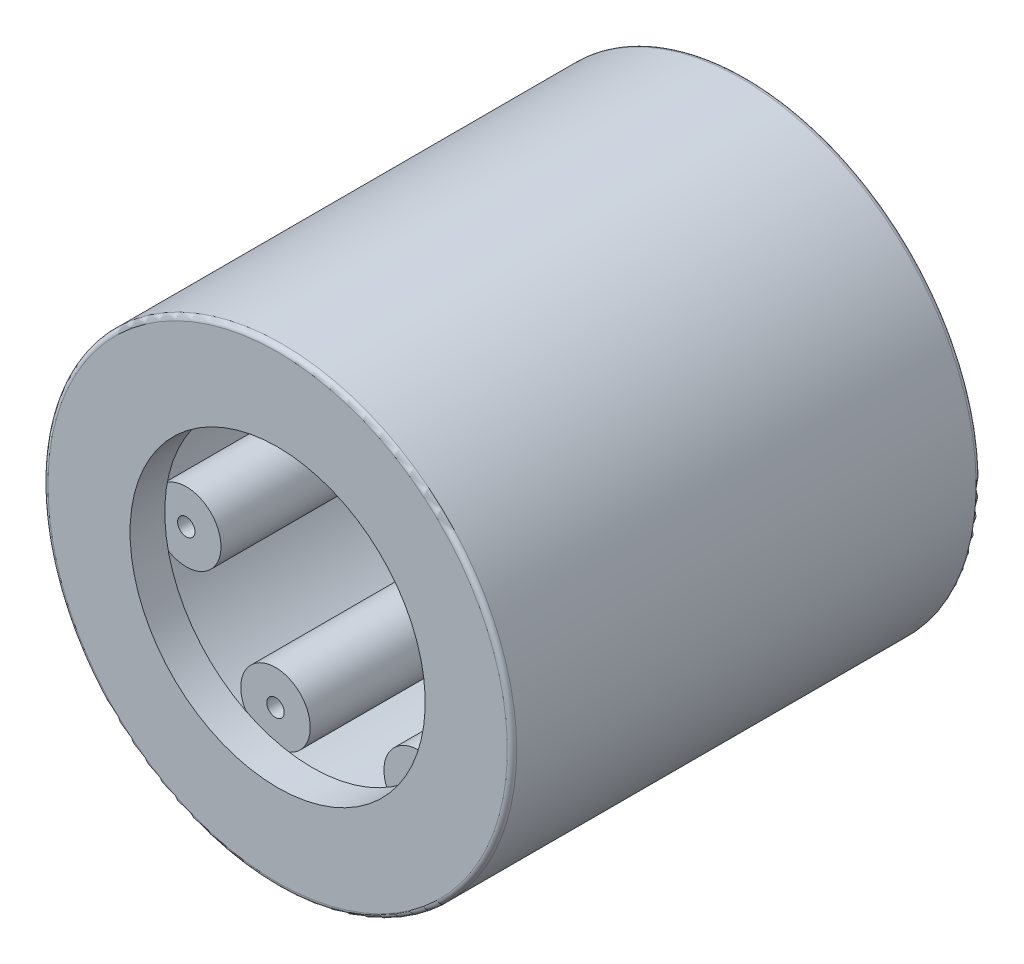
ISO-10303-21;
HEADER;
FILE_DESCRIPTION(('STEP AP214'),'2;1');
FILE_NAME('part.step','',(''),(''),'','','');
FILE_SCHEMA(('AUTOMOTIVE_DESIGN { 1 0 10303 214 1 1 1 1 }'));
ENDSEC;
DATA;
#1=APPLICATION_CONTEXT('core data for automotive mechanical design processes');
#2=APPLICATION_PROTOCOL_DEFINITION('international standard','automotive_design',2000,#1);
#3=PRODUCT_CONTEXT('',#1,'mechanical');
#4=PRODUCT('Part','Part','',(#3));
#5=PRODUCT_RELATED_PRODUCT_CATEGORY('part','',(#4));
#6=PRODUCT_DEFINITION_FORMATION('','',#4);
#7=PRODUCT_DEFINITION_CONTEXT('part definition',#1,'design');
#8=PRODUCT_DEFINITION('design','',#6,#7);
#9=PRODUCT_DEFINITION_SHAPE('','',#8);
#10=(LENGTH_UNIT() NAMED_UNIT(*) SI_UNIT(.MILLI.,.METRE.));
#11=(NAMED_UNIT(*) PLANE_ANGLE_UNIT() SI_UNIT($,.RADIAN.));
#12=(NAMED_UNIT(*) SI_UNIT($,.STERADIAN.) SOLID_ANGLE_UNIT());
#13=UNCERTAINTY_MEASURE_WITH_UNIT(LENGTH_MEASURE(1.E-05),#10,'distance_accuracy_value','');
#14=(GEOMETRIC_REPRESENTATION_CONTEXT(3) GLOBAL_UNCERTAINTY_ASSIGNED_CONTEXT((#13)) GLOBAL_UNIT_ASSIGNED_CONTEXT((#10,
#11,#12)) REPRESENTATION_CONTEXT('',''));
#15=CARTESIAN_POINT('',(0.,0.,0.));
#16=DIRECTION('',(0.,0.,1.));
#17=DIRECTION('',(1.,0.,0.));
#18=AXIS2_PLACEMENT_3D('',#15,#16,#17);
#19=CARTESIAN_POINT('',(0.,3.16666666666667,3.83333333333333));
#20=DIRECTION('',(0.,0.,-1.));
#21=DIRECTION('',(-1.,0.,0.));
#22=AXIS2_PLACEMENT_3D('',#19,#20,#21);
#23=PLANE('',#22);
#24=CARTESIAN_POINT('',(0.,3.16666666666667,3.83333333333333));
#25=DIRECTION('',(0.,0.,1.));
#26=DIRECTION('',(1.,0.,0.));
#27=AXIS2_PLACEMENT_3D('',#24,#25,#26);
#28=CIRCLE('',#27,0.166666666666666);
#29=CARTESIAN_POINT('',(0.166666666666666,3.16666666666667,3.83333333333333));
#30=VERTEX_POINT('',#29);
#31=EDGE_CURVE('E11',#30,#30,#28,.T.);
#32=ORIENTED_EDGE('',*,*,#31,.T.);
#33=EDGE_LOOP('',(#32));
#34=FACE_BOUND('',#33,.T.);
#35=ADVANCED_FACE('F51',(#34),#23,.F.);
#36=CARTESIAN_POINT('',(0.,3.16666666666667,3.83333333333333));
#37=DIRECTION('',(0.,0.,1.));
#38=DIRECTION('',(1.,0.,0.));
#39=AXIS2_PLACEMENT_3D('',#36,#37,#38);
#40=CYLINDRICAL_SURFACE('',#39,0.166666666666666);
#41=ORIENTED_EDGE('',*,*,#31,.F.);
#42=EDGE_LOOP('',(#41));
#43=FACE_BOUND('',#42,.T.);
#44=CARTESIAN_POINT('',(0.,3.16666666666667,-3.83333333333333));
#45=DIRECTION('',(0.,0.,1.));
#46=DIRECTION('',(1.,0.,0.));
#47=AXIS2_PLACEMENT_3D('',#44,#45,#46);
#48=CIRCLE('',#47,0.166666666666666);
#49=CARTESIAN_POINT('',(0.166666666666666,3.16666666666667,-3.83333333333333));
#50=VERTEX_POINT('',#49);
#51=EDGE_CURVE('E57',#50,#50,#48,.T.);
#52=ORIENTED_EDGE('',*,*,#51,.T.);
#53=EDGE_LOOP('',(#52));
#54=FACE_BOUND('',#53,.T.);
#55=ADVANCED_FACE('F63',(#43,#54),#40,.T.);
#56=CARTESIAN_POINT('',(0.,3.16666666666667,-3.83333333333333));
#57=DIRECTION('',(0.,0.,1.));
#58=DIRECTION('',(1.,0.,0.));
#59=AXIS2_PLACEMENT_3D('',#56,#57,#58);
#60=PLANE('',#59);
#61=ORIENTED_EDGE('',*,*,#51,.F.);
#62=EDGE_LOOP('',(#61));
#63=FACE_BOUND('',#62,.T.);
#64=ADVANCED_FACE('F65',(#63),#60,.F.);
#65=CLOSED_SHELL('',(#35,#55,#64));
#66=MANIFOLD_SOLID_BREP('B2',#65);
#67=CARTESIAN_POINT('',(0.,0.,4.5));
#68=DIRECTION('',(0.,0.,1.));
#69=DIRECTION('',(0.,-1.,0.));
#70=AXIS2_PLACEMENT_3D('',#67,#68,#69);
#71=CYLINDRICAL_SURFACE('',#70,3.73333333333333);
#72=CARTESIAN_POINT('',(0.,0.,-3.16666666666667));
#73=DIRECTION('',(0.,0.,1.));
#74=DIRECTION('',(1.,0.,0.));
#75=AXIS2_PLACEMENT_3D('',#72,#73,#74);
#76=CIRCLE('',#75,3.73333333333333);
#77=CARTESIAN_POINT('',(-3.53600489141785,-1.19768409259154,-3.16666666666667));
#78=VERTEX_POINT('',#77);
#79=CARTESIAN_POINT('',(-3.7054859762934,-0.455138942819345,-3.16666666666667));
#80=VERTEX_POINT('',#79);
#81=EDGE_CURVE('E206',#78,#80,#76,.F.);
#82=ORIENTED_EDGE('',*,*,#81,.F.);
#83=DIRECTION('',(0.,0.,1.));
#84=VECTOR('',#83,1.);
#85=CARTESIAN_POINT('',(-3.53600489141785,-1.19768409259154,0.));
#86=LINE('',#85,#84);
#87=CARTESIAN_POINT('',(-3.53600489141785,-1.19768409259154,3.16666666666667));
#88=VERTEX_POINT('',#87);
#89=EDGE_CURVE('E374',#88,#78,#86,.F.);
#90=ORIENTED_EDGE('',*,*,#89,.F.);
#91=CARTESIAN_POINT('',(0.,0.,3.16666666666667));
#92=DIRECTION('',(0.,0.,-1.));
#93=DIRECTION('',(-1.,0.,0.));
#94=AXIS2_PLACEMENT_3D('',#91,#92,#93);
#95=CIRCLE('',#94,3.73333333333333);
#96=CARTESIAN_POINT('',(-3.7054859762934,-0.455138942819348,3.16666666666667));
#97=VERTEX_POINT('',#96);
#98=EDGE_CURVE('E368',#97,#88,#95,.F.);
#99=ORIENTED_EDGE('',*,*,#98,.F.);
#100=DIRECTION('',(0.,0.,1.));
#101=VECTOR('',#100,1.);
#102=CARTESIAN_POINT('',(-3.7054859762934,-0.455138942819345,0.));
#103=LINE('',#102,#101);
#104=EDGE_CURVE('E371',#80,#97,#103,.T.);
#105=ORIENTED_EDGE('',*,*,#104,.F.);
#106=EDGE_LOOP('',(#82,#90,#99,#105));
#107=FACE_BOUND('',#106,.T.);
#108=CARTESIAN_POINT('',(0.,0.,-3.16666666666667));
#109=DIRECTION('',(0.,0.,1.));
#110=DIRECTION('',(0.,-1.,0.));
#111=AXIS2_PLACEMENT_3D('',#108,#109,#110);
#112=CIRCLE('',#111,3.73333333333333);
#113=CARTESIAN_POINT('',(1.95449076275606,-3.18084008338662,-3.16666666666667));
#114=VERTEX_POINT('',#113);
#115=CARTESIAN_POINT('',(1.26827585948236,-3.5113037638507,-3.16666666666667));
#116=VERTEX_POINT('',#115);
#117=EDGE_CURVE('E353',#114,#116,#112,.F.);
#118=ORIENTED_EDGE('',*,*,#117,.F.);
#119=DIRECTION('',(0.,0.,1.));
#120=VECTOR('',#119,1.);
#121=CARTESIAN_POINT('',(1.95449076275606,-3.18084008338662,0.));
#122=LINE('',#121,#120);
#123=CARTESIAN_POINT('',(1.95449076275606,-3.18084008338662,3.16666666666667));
#124=VERTEX_POINT('',#123);
#125=EDGE_CURVE('E350',#124,#114,#122,.F.);
#126=ORIENTED_EDGE('',*,*,#125,.F.);
#127=CARTESIAN_POINT('',(0.,0.,3.16666666666667));
#128=DIRECTION('',(0.,0.,-1.));
#129=DIRECTION('',(0.,1.,0.));
#130=AXIS2_PLACEMENT_3D('',#127,#128,#129);
#131=CIRCLE('',#130,3.73333333333333);
#132=CARTESIAN_POINT('',(1.26827585948235,-3.5113037638507,3.16666666666667));
#133=VERTEX_POINT('',#132);
#134=EDGE_CURVE('E344',#133,#124,#131,.F.);
#135=ORIENTED_EDGE('',*,*,#134,.F.);
#136=DIRECTION('',(0.,0.,1.));
#137=VECTOR('',#136,1.);
#138=CARTESIAN_POINT('',(1.26827585948235,-3.5113037638507,0.));
#139=LINE('',#138,#137);
#140=EDGE_CURVE('E347',#116,#133,#139,.T.);
#141=ORIENTED_EDGE('',*,*,#140,.F.);
#142=EDGE_LOOP('',(#118,#126,#135,#141));
#143=FACE_BOUND('',#142,.T.);
#144=CARTESIAN_POINT('',(0.,0.,-3.16666666666667));
#145=DIRECTION('',(0.,0.,1.));
#146=DIRECTION('',(1.,0.,0.));
#147=AXIS2_PLACEMENT_3D('',#144,#145,#146);
#148=CIRCLE('',#147,3.73333333333333);
#149=CARTESIAN_POINT('',(2.6661746715429,2.61329110483331,-3.16666666666667));
#150=VERTEX_POINT('',#149);
#151=CARTESIAN_POINT('',(3.14105011876087,2.01781612869213,-3.16666666666667));
#152=VERTEX_POINT('',#151);
#153=EDGE_CURVE('E329',#150,#152,#148,.F.);
#154=ORIENTED_EDGE('',*,*,#153,.F.);
#155=DIRECTION('',(0.,0.,1.));
#156=VECTOR('',#155,1.);
#157=CARTESIAN_POINT('',(2.6661746715429,2.6132911048333,0.));
#158=LINE('',#157,#156);
#159=CARTESIAN_POINT('',(2.6661746715429,2.6132911048333,3.16666666666667));
#160=VERTEX_POINT('',#159);
#161=EDGE_CURVE('E326',#160,#150,#158,.F.);
#162=ORIENTED_EDGE('',*,*,#161,.F.);
#163=CARTESIAN_POINT('',(0.,0.,3.16666666666667));
#164=DIRECTION('',(0.,0.,-1.));
#165=DIRECTION('',(-1.,0.,0.));
#166=AXIS2_PLACEMENT_3D('',#163,#164,#165);
#167=CIRCLE('',#166,3.73333333333333);
#168=CARTESIAN_POINT('',(3.14105011876087,2.01781612869213,3.16666666666667));
#169=VERTEX_POINT('',#168);
#170=EDGE_CURVE('E320',#169,#160,#167,.F.);
#171=ORIENTED_EDGE('',*,*,#170,.F.);
#172=DIRECTION('',(0.,0.,1.));
#173=VECTOR('',#172,1.);
#174=CARTESIAN_POINT('',(3.14105011876087,2.01781612869213,0.));
#175=LINE('',#174,#173);
#176=EDGE_CURVE('E323',#152,#169,#175,.T.);
#177=ORIENTED_EDGE('',*,*,#176,.F.);
#178=EDGE_LOOP('',(#154,#162,#171,#177));
#179=FACE_BOUND('',#178,.T.);
#180=CARTESIAN_POINT('',(0.,0.,3.83333333333333));
#181=DIRECTION('',(0.,0.,1.));
#182=DIRECTION('',(0.,-1.,0.));
#183=AXIS2_PLACEMENT_3D('',#180,#181,#182);
#184=CIRCLE('',#183,3.73333333333333);
#185=CARTESIAN_POINT('',(0.,-3.73333333333333,3.83333333333333));
#186=VERTEX_POINT('',#185);
#187=EDGE_CURVE('E299',#186,#186,#184,.T.);
#188=ORIENTED_EDGE('',*,*,#187,.T.);
#189=EDGE_LOOP('',(#188));
#190=FACE_BOUND('',#189,.T.);
#191=CARTESIAN_POINT('',(0.,0.,-3.83333333333333));
#192=DIRECTION('',(0.,0.,1.));
#193=DIRECTION('',(0.,-1.,0.));
#194=AXIS2_PLACEMENT_3D('',#191,#192,#193);
#195=CIRCLE('',#194,3.73333333333333);
#196=CARTESIAN_POINT('',(0.,-3.73333333333333,-3.83333333333333));
#197=VERTEX_POINT('',#196);
#198=EDGE_CURVE('E296',#197,#197,#195,.T.);
#199=ORIENTED_EDGE('',*,*,#198,.F.);
#200=EDGE_LOOP('',(#199));
#201=FACE_BOUND('',#200,.T.);
#202=CARTESIAN_POINT('',(0.,0.,-3.16666666666667));
#203=DIRECTION('',(0.,0.,1.));
#204=DIRECTION('',(0.,-1.,0.));
#205=AXIS2_PLACEMENT_3D('',#202,#203,#204);
#206=CIRCLE('',#205,3.73333333333333);
#207=CARTESIAN_POINT('',(-0.380820540931288,3.71385964912281,-3.16666666666667));
#208=VERTEX_POINT('',#207);
#209=CARTESIAN_POINT('',(0.380820540931288,3.71385964912281,-3.16666666666667));
#210=VERTEX_POINT('',#209);
#211=EDGE_CURVE('E317',#208,#210,#206,.F.);
#212=ORIENTED_EDGE('',*,*,#211,.F.);
#213=DIRECTION('',(0.,0.,1.));
#214=VECTOR('',#213,1.);
#215=CARTESIAN_POINT('',(-0.380820540931288,3.71385964912281,0.));
#216=LINE('',#215,#214);
#217=CARTESIAN_POINT('',(-0.380820540931288,3.71385964912281,3.16666666666667));
#218=VERTEX_POINT('',#217);
#219=EDGE_CURVE('E314',#218,#208,#216,.F.);
#220=ORIENTED_EDGE('',*,*,#219,.F.);
#221=CARTESIAN_POINT('',(0.,0.,3.16666666666667));
#222=DIRECTION('',(0.,0.,-1.));
#223=DIRECTION('',(0.,1.,0.));
#224=AXIS2_PLACEMENT_3D('',#221,#222,#223);
#225=CIRCLE('',#224,3.73333333333333);
#226=CARTESIAN_POINT('',(0.380820540931288,3.71385964912281,3.16666666666667));
#227=VERTEX_POINT('',#226);
#228=EDGE_CURVE('E308',#227,#218,#225,.F.);
#229=ORIENTED_EDGE('',*,*,#228,.F.);
#230=DIRECTION('',(0.,0.,1.));
#231=VECTOR('',#230,1.);
#232=CARTESIAN_POINT('',(0.380820540931288,3.71385964912281,0.));
#233=LINE('',#232,#231);
#234=EDGE_CURVE('E311',#210,#227,#233,.T.);
#235=ORIENTED_EDGE('',*,*,#234,.F.);
#236=EDGE_LOOP('',(#212,#220,#229,#235));
#237=FACE_BOUND('',#236,.T.);
#238=CARTESIAN_POINT('',(0.,0.,-3.16666666666667));
#239=DIRECTION('',(0.,0.,1.));
#240=DIRECTION('',(1.,0.,0.));
#241=AXIS2_PLACEMENT_3D('',#238,#239,#240);
#242=CIRCLE('',#241,3.73333333333333);
#243=CARTESIAN_POINT('',(3.70548597629339,-0.455138942819395,-3.16666666666667));
#244=VERTEX_POINT('',#243);
#245=CARTESIAN_POINT('',(3.53600489141783,-1.19768409259159,-3.16666666666667));
#246=VERTEX_POINT('',#245);
#247=EDGE_CURVE('E341',#244,#246,#242,.F.);
#248=ORIENTED_EDGE('',*,*,#247,.F.);
#249=DIRECTION('',(0.,0.,1.));
#250=VECTOR('',#249,1.);
#251=CARTESIAN_POINT('',(3.70548597629339,-0.455138942819395,0.));
#252=LINE('',#251,#250);
#253=CARTESIAN_POINT('',(3.70548597629339,-0.455138942819398,3.16666666666667));
#254=VERTEX_POINT('',#253);
#255=EDGE_CURVE('E338',#254,#244,#252,.F.);
#256=ORIENTED_EDGE('',*,*,#255,.F.);
#257=CARTESIAN_POINT('',(0.,0.,3.16666666666667));
#258=DIRECTION('',(0.,0.,-1.));
#259=DIRECTION('',(-1.,0.,0.));
#260=AXIS2_PLACEMENT_3D('',#257,#258,#259);
#261=CIRCLE('',#260,3.73333333333333);
#262=CARTESIAN_POINT('',(3.53600489141783,-1.19768409259158,3.16666666666667));
#263=VERTEX_POINT('',#262);
#264=EDGE_CURVE('E332',#263,#254,#261,.F.);
#265=ORIENTED_EDGE('',*,*,#264,.F.);
#266=DIRECTION('',(0.,0.,1.));
#267=VECTOR('',#266,1.);
#268=CARTESIAN_POINT('',(3.53600489141783,-1.19768409259159,0.));
#269=LINE('',#268,#267);
#270=EDGE_CURVE('E335',#246,#263,#269,.T.);
#271=ORIENTED_EDGE('',*,*,#270,.F.);
#272=EDGE_LOOP('',(#248,#256,#265,#271));
#273=FACE_BOUND('',#272,.T.);
#274=CARTESIAN_POINT('',(0.,0.,-3.16666666666667));
#275=DIRECTION('',(0.,0.,1.));
#276=DIRECTION('',(0.,-1.,0.));
#277=AXIS2_PLACEMENT_3D('',#274,#275,#276);
#278=CIRCLE('',#277,3.73333333333333);
#279=CARTESIAN_POINT('',(-1.2682758594824,-3.51130376385068,-3.16666666666667));
#280=VERTEX_POINT('',#279);
#281=CARTESIAN_POINT('',(-1.9544907627561,-3.1808400833866,-3.16666666666667));
#282=VERTEX_POINT('',#281);
#283=EDGE_CURVE('E365',#280,#282,#278,.F.);
#284=ORIENTED_EDGE('',*,*,#283,.F.);
#285=DIRECTION('',(0.,0.,1.));
#286=VECTOR('',#285,1.);
#287=CARTESIAN_POINT('',(-1.2682758594824,-3.51130376385068,0.));
#288=LINE('',#287,#286);
#289=CARTESIAN_POINT('',(-1.2682758594824,-3.51130376385068,3.16666666666667));
#290=VERTEX_POINT('',#289);
#291=EDGE_CURVE('E362',#290,#280,#288,.F.);
#292=ORIENTED_EDGE('',*,*,#291,.F.);
#293=CARTESIAN_POINT('',(0.,0.,3.16666666666667));
#294=DIRECTION('',(0.,0.,-1.));
#295=DIRECTION('',(0.,1.,0.));
#296=AXIS2_PLACEMENT_3D('',#293,#294,#295);
#297=CIRCLE('',#296,3.73333333333333);
#298=CARTESIAN_POINT('',(-1.9544907627561,-3.1808400833866,3.16666666666667));
#299=VERTEX_POINT('',#298);
#300=EDGE_CURVE('E356',#299,#290,#297,.F.);
#301=ORIENTED_EDGE('',*,*,#300,.F.);
#302=DIRECTION('',(0.,0.,1.));
#303=VECTOR('',#302,1.);
#304=CARTESIAN_POINT('',(-1.9544907627561,-3.1808400833866,0.));
#305=LINE('',#304,#303);
#306=EDGE_CURVE('E359',#282,#299,#305,.T.);
#307=ORIENTED_EDGE('',*,*,#306,.F.);
#308=EDGE_LOOP('',(#284,#292,#301,#307));
#309=FACE_BOUND('',#308,.T.);
#310=CARTESIAN_POINT('',(0.,0.,-3.16666666666667));
#311=DIRECTION('',(0.,0.,1.));
#312=DIRECTION('',(1.,0.,0.));
#313=AXIS2_PLACEMENT_3D('',#310,#311,#312);
#314=CIRCLE('',#313,3.73333333333333);
#315=CARTESIAN_POINT('',(-3.14105011876084,2.01781612869217,-3.16666666666667));
#316=VERTEX_POINT('',#315);
#317=CARTESIAN_POINT('',(-2.66617467154286,2.61329110483334,-3.16666666666667));
#318=VERTEX_POINT('',#317);
#319=EDGE_CURVE('E113',#316,#318,#314,.F.);
#320=ORIENTED_EDGE('',*,*,#319,.F.);
#321=DIRECTION('',(0.,0.,1.));
#322=VECTOR('',#321,1.);
#323=CARTESIAN_POINT('',(-3.14105011876084,2.01781612869217,0.));
#324=LINE('',#323,#322);
#325=CARTESIAN_POINT('',(-3.14105011876084,2.01781612869218,3.16666666666667));
#326=VERTEX_POINT('',#325);
#327=EDGE_CURVE('E194',#326,#316,#324,.F.);
#328=ORIENTED_EDGE('',*,*,#327,.F.);
#329=CARTESIAN_POINT('',(0.,0.,3.16666666666667));
#330=DIRECTION('',(0.,0.,-1.));
#331=DIRECTION('',(-1.,0.,0.));
#332=AXIS2_PLACEMENT_3D('',#329,#330,#331);
#333=CIRCLE('',#332,3.73333333333333);
#334=CARTESIAN_POINT('',(-2.66617467154286,2.61329110483334,3.16666666666667));
#335=VERTEX_POINT('',#334);
#336=EDGE_CURVE('E196',#335,#326,#333,.F.);
#337=ORIENTED_EDGE('',*,*,#336,.F.);
#338=DIRECTION('',(0.,0.,1.));
#339=VECTOR('',#338,1.);
#340=CARTESIAN_POINT('',(-2.66617467154286,2.61329110483334,0.));
#341=LINE('',#340,#339);
#342=EDGE_CURVE('E118',#318,#335,#341,.T.);
#343=ORIENTED_EDGE('',*,*,#342,.F.);
#344=EDGE_LOOP('',(#320,#328,#337,#343));
#345=FACE_BOUND('',#344,.T.);
#346=ADVANCED_FACE('F98',(#107,#143,#179,#190,#201,#237,#273,#309,#345),#71,.F.);
#347=CARTESIAN_POINT('',(0.,0.,4.5));
#348=DIRECTION('',(0.,0.,1.));
#349=DIRECTION('',(0.,-1.,0.));
#350=AXIS2_PLACEMENT_3D('',#347,#348,#349);
#351=CYLINDRICAL_SURFACE('',#350,4.5);
#352=CARTESIAN_POINT('',(0.,0.,-4.41));
#353=DIRECTION('',(0.,0.,1.));
#354=DIRECTION('',(0.,-1.,0.));
#355=AXIS2_PLACEMENT_3D('',#352,#353,#354);
#356=CIRCLE('',#355,4.5);
#357=CARTESIAN_POINT('',(0.,-4.5,-4.41));
#358=VERTEX_POINT('',#357);
#359=EDGE_CURVE('E384',#358,#358,#356,.T.);
#360=ORIENTED_EDGE('',*,*,#359,.T.);
#361=EDGE_LOOP('',(#360));
#362=FACE_BOUND('',#361,.T.);
#363=CARTESIAN_POINT('',(0.,0.,4.41));
#364=DIRECTION('',(0.,0.,-1.));
#365=DIRECTION('',(0.,1.,0.));
#366=AXIS2_PLACEMENT_3D('',#363,#364,#365);
#367=CIRCLE('',#366,4.5);
#368=CARTESIAN_POINT('',(0.,4.5,4.41));
#369=VERTEX_POINT('',#368);
#370=EDGE_CURVE('E381',#369,#369,#367,.T.);
#371=ORIENTED_EDGE('',*,*,#370,.T.);
#372=EDGE_LOOP('',(#371));
#373=FACE_BOUND('',#372,.T.);
#374=ADVANCED_FACE('F398',(#362,#373),#351,.T.);
#375=CARTESIAN_POINT('',(0.,4.5,4.5));
#376=DIRECTION('',(0.,0.,-1.));
#377=DIRECTION('',(0.,1.,0.));
#378=AXIS2_PLACEMENT_3D('',#375,#376,#377);
#379=PLANE('',#378);
#380=CARTESIAN_POINT('',(0.,0.,4.5));
#381=DIRECTION('',(0.,0.,-1.));
#382=DIRECTION('',(0.,1.,0.));
#383=AXIS2_PLACEMENT_3D('',#380,#381,#382);
#384=CIRCLE('',#383,4.41);
#385=CARTESIAN_POINT('',(0.,4.41,4.5));
#386=VERTEX_POINT('',#385);
#387=EDGE_CURVE('E49',#386,#386,#384,.F.);
#388=ORIENTED_EDGE('',*,*,#387,.T.);
#389=EDGE_LOOP('',(#388));
#390=FACE_BOUND('',#389,.T.);
#391=CARTESIAN_POINT('',(0.,0.,4.5));
#392=DIRECTION('',(0.,0.,1.));
#393=DIRECTION('',(0.,-1.,0.));
#394=AXIS2_PLACEMENT_3D('',#391,#392,#393);
#395=CIRCLE('',#394,2.83333333333333);
#396=CARTESIAN_POINT('',(0.,-2.83333333333333,4.5));
#397=VERTEX_POINT('',#396);
#398=EDGE_CURVE('E305',#397,#397,#395,.T.);
#399=ORIENTED_EDGE('',*,*,#398,.F.);
#400=EDGE_LOOP('',(#399));
#401=FACE_BOUND('',#400,.T.);
#402=ADVANCED_FACE('F401',(#390,#401),#379,.F.);
#403=CARTESIAN_POINT('',(0.,0.,4.5));
#404=DIRECTION('',(0.,0.,1.));
#405=DIRECTION('',(0.,-1.,0.));
#406=AXIS2_PLACEMENT_3D('',#403,#404,#405);
#407=CYLINDRICAL_SURFACE('',#406,2.83333333333333);
#408=CARTESIAN_POINT('',(0.,0.,3.83333333333333));
#409=DIRECTION('',(0.,0.,1.));
#410=DIRECTION('',(0.,-1.,0.));
#411=AXIS2_PLACEMENT_3D('',#408,#409,#410);
#412=CIRCLE('',#411,2.83333333333333);
#413=CARTESIAN_POINT('',(0.,-2.83333333333333,3.83333333333333));
#414=VERTEX_POINT('',#413);
#415=EDGE_CURVE('E302',#414,#414,#412,.T.);
#416=ORIENTED_EDGE('',*,*,#415,.F.);
#417=EDGE_LOOP('',(#416));
#418=FACE_BOUND('',#417,.T.);
#419=ORIENTED_EDGE('',*,*,#398,.T.);
#420=EDGE_LOOP('',(#419));
#421=FACE_BOUND('',#420,.T.);
#422=ADVANCED_FACE('F411',(#418,#421),#407,.F.);
#423=CARTESIAN_POINT('',(0.,2.83333333333333,3.83333333333333));
#424=DIRECTION('',(0.,0.,1.));
#425=DIRECTION('',(0.,-1.,0.));
#426=AXIS2_PLACEMENT_3D('',#423,#424,#425);
#427=PLANE('',#426);
#428=ORIENTED_EDGE('',*,*,#187,.F.);
#429=EDGE_LOOP('',(#428));
#430=FACE_BOUND('',#429,.T.);
#431=ORIENTED_EDGE('',*,*,#415,.T.);
#432=EDGE_LOOP('',(#431));
#433=FACE_BOUND('',#432,.T.);
#434=ADVANCED_FACE('F416',(#430,#433),#427,.F.);
#435=CARTESIAN_POINT('',(0.,3.73333333333333,-3.83333333333333));
#436=DIRECTION('',(0.,0.,-1.));
#437=DIRECTION('',(0.,1.,0.));
#438=AXIS2_PLACEMENT_3D('',#435,#436,#437);
#439=PLANE('',#438);
#440=CARTESIAN_POINT('',(0.,0.,-3.83333333333333));
#441=DIRECTION('',(0.,0.,1.));
#442=DIRECTION('',(0.,-1.,0.));
#443=AXIS2_PLACEMENT_3D('',#440,#441,#442);
#444=CIRCLE('',#443,2.83333333333333);
#445=CARTESIAN_POINT('',(0.,-2.83333333333333,-3.83333333333333));
#446=VERTEX_POINT('',#445);
#447=EDGE_CURVE('E293',#446,#446,#444,.T.);
#448=ORIENTED_EDGE('',*,*,#447,.F.);
#449=EDGE_LOOP('',(#448));
#450=FACE_BOUND('',#449,.T.);
#451=ORIENTED_EDGE('',*,*,#198,.T.);
#452=EDGE_LOOP('',(#451));
#453=FACE_BOUND('',#452,.T.);
#454=ADVANCED_FACE('F423',(#450,#453),#439,.F.);
#455=CARTESIAN_POINT('',(0.,0.,4.5));
#456=DIRECTION('',(0.,0.,1.));
#457=DIRECTION('',(0.,-1.,0.));
#458=AXIS2_PLACEMENT_3D('',#455,#456,#457);
#459=CYLINDRICAL_SURFACE('',#458,2.83333333333333);
#460=CARTESIAN_POINT('',(0.,0.,-4.5));
#461=DIRECTION('',(0.,0.,1.));
#462=DIRECTION('',(0.,-1.,0.));
#463=AXIS2_PLACEMENT_3D('',#460,#461,#462);
#464=CIRCLE('',#463,2.83333333333333);
#465=CARTESIAN_POINT('',(0.,-2.83333333333333,-4.5));
#466=VERTEX_POINT('',#465);
#467=EDGE_CURVE('E290',#466,#466,#464,.T.);
#468=ORIENTED_EDGE('',*,*,#467,.F.);
#469=EDGE_LOOP('',(#468));
#470=FACE_BOUND('',#469,.T.);
#471=ORIENTED_EDGE('',*,*,#447,.T.);
#472=EDGE_LOOP('',(#471));
#473=FACE_BOUND('',#472,.T.);
#474=ADVANCED_FACE('F438',(#470,#473),#459,.F.);
#475=CARTESIAN_POINT('',(0.,2.83333333333333,-4.5));
#476=DIRECTION('',(0.,0.,1.));
#477=DIRECTION('',(0.,-1.,0.));
#478=AXIS2_PLACEMENT_3D('',#475,#476,#477);
#479=PLANE('',#478);
#480=CARTESIAN_POINT('',(0.,0.,-4.5));
#481=DIRECTION('',(0.,0.,1.));
#482=DIRECTION('',(0.,-1.,0.));
#483=AXIS2_PLACEMENT_3D('',#480,#481,#482);
#484=CIRCLE('',#483,4.41);
#485=CARTESIAN_POINT('',(0.,-4.41,-4.5));
#486=VERTEX_POINT('',#485);
#487=EDGE_CURVE('E106',#486,#486,#484,.F.);
#488=ORIENTED_EDGE('',*,*,#487,.T.);
#489=EDGE_LOOP('',(#488));
#490=FACE_BOUND('',#489,.T.);
#491=ORIENTED_EDGE('',*,*,#467,.T.);
#492=EDGE_LOOP('',(#491));
#493=FACE_BOUND('',#492,.T.);
#494=ADVANCED_FACE('F389',(#490,#493),#479,.F.);
#495=CARTESIAN_POINT('',(0.,3.83333333333333,-3.16666666666667));
#496=DIRECTION('',(0.,0.,1.));
#497=DIRECTION('',(0.,-1.,0.));
#498=AXIS2_PLACEMENT_3D('',#495,#496,#497);
#499=PLANE('',#498);
#500=CARTESIAN_POINT('',(0.,3.16666666666667,-3.16666666666667));
#501=DIRECTION('',(0.,0.,1.));
#502=DIRECTION('',(0.,-1.,0.));
#503=AXIS2_PLACEMENT_3D('',#500,#501,#502);
#504=CIRCLE('',#503,0.166666666666666);
#505=CARTESIAN_POINT('',(0.,3.,-3.16666666666667));
#506=VERTEX_POINT('',#505);
#507=EDGE_CURVE('E278',#506,#506,#504,.T.);
#508=ORIENTED_EDGE('',*,*,#507,.T.);
#509=EDGE_LOOP('',(#508));
#510=FACE_BOUND('',#509,.T.);
#511=CARTESIAN_POINT('',(0.,3.16666666666667,-3.16666666666667));
#512=DIRECTION('',(0.,0.,1.));
#513=DIRECTION('',(0.,-1.,0.));
#514=AXIS2_PLACEMENT_3D('',#511,#512,#513);
#515=CIRCLE('',#514,0.666666666666667);
#516=EDGE_CURVE('E287',#208,#210,#515,.T.);
#517=ORIENTED_EDGE('',*,*,#516,.F.);
#518=ORIENTED_EDGE('',*,*,#211,.T.);
#519=EDGE_LOOP('',(#517,#518));
#520=FACE_BOUND('',#519,.T.);
#521=ADVANCED_FACE('F445',(#510,#520),#499,.F.);
#522=CARTESIAN_POINT('',(0.,3.16666666666667,3.16666666666667));
#523=DIRECTION('',(0.,0.,1.));
#524=DIRECTION('',(0.,-1.,0.));
#525=AXIS2_PLACEMENT_3D('',#522,#523,#524);
#526=CYLINDRICAL_SURFACE('',#525,0.666666666666667);
#527=CARTESIAN_POINT('',(0.,3.16666666666667,3.16666666666667));
#528=DIRECTION('',(0.,0.,1.));
#529=DIRECTION('',(0.,-1.,0.));
#530=AXIS2_PLACEMENT_3D('',#527,#528,#529);
#531=CIRCLE('',#530,0.666666666666667);
#532=EDGE_CURVE('E284',#218,#227,#531,.T.);
#533=ORIENTED_EDGE('',*,*,#532,.F.);
#534=ORIENTED_EDGE('',*,*,#219,.T.);
#535=ORIENTED_EDGE('',*,*,#516,.T.);
#536=ORIENTED_EDGE('',*,*,#234,.T.);
#537=EDGE_LOOP('',(#533,#534,#535,#536));
#538=FACE_BOUND('',#537,.T.);
#539=ADVANCED_FACE('F448',(#538),#526,.T.);
#540=CARTESIAN_POINT('',(0.,3.83333333333333,3.16666666666667));
#541=DIRECTION('',(0.,0.,-1.));
#542=DIRECTION('',(0.,1.,0.));
#543=AXIS2_PLACEMENT_3D('',#540,#541,#542);
#544=PLANE('',#543);
#545=CARTESIAN_POINT('',(0.,3.16666666666667,3.16666666666667));
#546=DIRECTION('',(0.,0.,1.));
#547=DIRECTION('',(0.,-1.,0.));
#548=AXIS2_PLACEMENT_3D('',#545,#546,#547);
#549=CIRCLE('',#548,0.166666666666666);
#550=CARTESIAN_POINT('',(0.,3.,3.16666666666667));
#551=VERTEX_POINT('',#550);
#552=EDGE_CURVE('E281',#551,#551,#549,.T.);
#553=ORIENTED_EDGE('',*,*,#552,.F.);
#554=EDGE_LOOP('',(#553));
#555=FACE_BOUND('',#554,.T.);
#556=ORIENTED_EDGE('',*,*,#532,.T.);
#557=ORIENTED_EDGE('',*,*,#228,.T.);
#558=EDGE_LOOP('',(#556,#557));
#559=FACE_BOUND('',#558,.T.);
#560=ADVANCED_FACE('F452',(#555,#559),#544,.F.);
#561=CARTESIAN_POINT('',(0.,3.16666666666667,3.16666666666667));
#562=DIRECTION('',(0.,0.,1.));
#563=DIRECTION('',(0.,-1.,0.));
#564=AXIS2_PLACEMENT_3D('',#561,#562,#563);
#565=CYLINDRICAL_SURFACE('',#564,0.166666666666666);
#566=ORIENTED_EDGE('',*,*,#507,.F.);
#567=EDGE_LOOP('',(#566));
#568=FACE_BOUND('',#567,.T.);
#569=ORIENTED_EDGE('',*,*,#552,.T.);
#570=EDGE_LOOP('',(#569));
#571=FACE_BOUND('',#570,.T.);
#572=ADVANCED_FACE('F456',(#568,#571),#565,.F.);
#573=CARTESIAN_POINT('',(2.99702068279412,2.39004424045847,-3.16666666666667));
#574=DIRECTION('',(0.,0.,1.));
#575=DIRECTION('',(-0.781831482468031,-0.623489801858732,0.));
#576=AXIS2_PLACEMENT_3D('',#573,#574,#575);
#577=PLANE('',#576);
#578=CARTESIAN_POINT('',(2.4757996944821,1.97438437255265,-3.16666666666667));
#579=DIRECTION('',(0.,0.,1.));
#580=DIRECTION('',(-0.781831482468031,-0.623489801858732,0.));
#581=AXIS2_PLACEMENT_3D('',#578,#579,#580);
#582=CIRCLE('',#581,0.166666666666666);
#583=CARTESIAN_POINT('',(2.34549444740409,1.8704694055762,-3.16666666666667));
#584=VERTEX_POINT('',#583);
#585=EDGE_CURVE('E266',#584,#584,#582,.T.);
#586=ORIENTED_EDGE('',*,*,#585,.T.);
#587=EDGE_LOOP('',(#586));
#588=FACE_BOUND('',#587,.T.);
#589=CARTESIAN_POINT('',(2.4757996944821,1.97438437255265,-3.16666666666667));
#590=DIRECTION('',(0.,0.,1.));
#591=DIRECTION('',(-0.781831482468031,-0.623489801858732,0.));
#592=AXIS2_PLACEMENT_3D('',#589,#590,#591);
#593=CIRCLE('',#592,0.666666666666667);
#594=EDGE_CURVE('E275',#150,#152,#593,.T.);
#595=ORIENTED_EDGE('',*,*,#594,.F.);
#596=ORIENTED_EDGE('',*,*,#153,.T.);
#597=EDGE_LOOP('',(#595,#596));
#598=FACE_BOUND('',#597,.T.);
#599=ADVANCED_FACE('F460',(#588,#598),#577,.F.);
#600=CARTESIAN_POINT('',(2.4757996944821,1.97438437255265,3.16666666666667));
#601=DIRECTION('',(0.,0.,1.));
#602=DIRECTION('',(-0.781831482468031,-0.623489801858732,0.));
#603=AXIS2_PLACEMENT_3D('',#600,#601,#602);
#604=CYLINDRICAL_SURFACE('',#603,0.666666666666667);
#605=CARTESIAN_POINT('',(2.4757996944821,1.97438437255265,3.16666666666667));
#606=DIRECTION('',(0.,0.,1.));
#607=DIRECTION('',(-0.781831482468031,-0.623489801858732,0.));
#608=AXIS2_PLACEMENT_3D('',#605,#606,#607);
#609=CIRCLE('',#608,0.666666666666667);
#610=EDGE_CURVE('E272',#160,#169,#609,.T.);
#611=ORIENTED_EDGE('',*,*,#610,.F.);
#612=ORIENTED_EDGE('',*,*,#161,.T.);
#613=ORIENTED_EDGE('',*,*,#594,.T.);
#614=ORIENTED_EDGE('',*,*,#176,.T.);
#615=EDGE_LOOP('',(#611,#612,#613,#614));
#616=FACE_BOUND('',#615,.T.);
#617=ADVANCED_FACE('F464',(#616),#604,.T.);
#618=CARTESIAN_POINT('',(2.99702068279412,2.39004424045847,3.16666666666667));
#619=DIRECTION('',(0.,0.,-1.));
#620=DIRECTION('',(0.781831482468031,0.623489801858732,0.));
#621=AXIS2_PLACEMENT_3D('',#618,#619,#620);
#622=PLANE('',#621);
#623=CARTESIAN_POINT('',(2.4757996944821,1.97438437255265,3.16666666666667));
#624=DIRECTION('',(0.,0.,1.));
#625=DIRECTION('',(-0.781831482468031,-0.623489801858732,0.));
#626=AXIS2_PLACEMENT_3D('',#623,#624,#625);
#627=CIRCLE('',#626,0.166666666666666);
#628=CARTESIAN_POINT('',(2.34549444740409,1.8704694055762,3.16666666666667));
#629=VERTEX_POINT('',#628);
#630=EDGE_CURVE('E269',#629,#629,#627,.T.);
#631=ORIENTED_EDGE('',*,*,#630,.F.);
#632=EDGE_LOOP('',(#631));
#633=FACE_BOUND('',#632,.T.);
#634=ORIENTED_EDGE('',*,*,#610,.T.);
#635=ORIENTED_EDGE('',*,*,#170,.T.);
#636=EDGE_LOOP('',(#634,#635));
#637=FACE_BOUND('',#636,.T.);
#638=ADVANCED_FACE('F468',(#633,#637),#622,.F.);
#639=CARTESIAN_POINT('',(2.4757996944821,1.97438437255265,3.16666666666667));
#640=DIRECTION('',(0.,0.,1.));
#641=DIRECTION('',(-0.781831482468031,-0.623489801858732,0.));
#642=AXIS2_PLACEMENT_3D('',#639,#640,#641);
#643=CYLINDRICAL_SURFACE('',#642,0.166666666666666);
#644=ORIENTED_EDGE('',*,*,#585,.F.);
#645=EDGE_LOOP('',(#644));
#646=FACE_BOUND('',#645,.T.);
#647=ORIENTED_EDGE('',*,*,#630,.T.);
#648=EDGE_LOOP('',(#647));
#649=FACE_BOUND('',#648,.T.);
#650=ADVANCED_FACE('F472',(#646,#649),#643,.F.);
#651=CARTESIAN_POINT('',(3.73722366336365,-0.85299691349922,-3.16666666666667));
#652=DIRECTION('',(0.,0.,1.));
#653=DIRECTION('',(-0.974927912181823,0.222520933956318,0.));
#654=AXIS2_PLACEMENT_3D('',#651,#652,#653);
#655=PLANE('',#654);
#656=CARTESIAN_POINT('',(3.08727172190911,-0.704649624195008,-3.16666666666667));
#657=DIRECTION('',(0.,0.,1.));
#658=DIRECTION('',(-0.974927912181823,0.222520933956318,0.));
#659=AXIS2_PLACEMENT_3D('',#656,#657,#658);
#660=CIRCLE('',#659,0.166666666666666);
#661=CARTESIAN_POINT('',(2.92478373654547,-0.667562801868955,-3.16666666666667));
#662=VERTEX_POINT('',#661);
#663=EDGE_CURVE('E254',#662,#662,#660,.T.);
#664=ORIENTED_EDGE('',*,*,#663,.T.);
#665=EDGE_LOOP('',(#664));
#666=FACE_BOUND('',#665,.T.);
#667=CARTESIAN_POINT('',(3.08727172190911,-0.704649624195008,-3.16666666666667));
#668=DIRECTION('',(0.,0.,1.));
#669=DIRECTION('',(-0.974927912181823,0.222520933956318,0.));
#670=AXIS2_PLACEMENT_3D('',#667,#668,#669);
#671=CIRCLE('',#670,0.666666666666667);
#672=EDGE_CURVE('E263',#244,#246,#671,.T.);
#673=ORIENTED_EDGE('',*,*,#672,.F.);
#674=ORIENTED_EDGE('',*,*,#247,.T.);
#675=EDGE_LOOP('',(#673,#674));
#676=FACE_BOUND('',#675,.T.);
#677=ADVANCED_FACE('F476',(#666,#676),#655,.F.);
#678=CARTESIAN_POINT('',(3.0872717219091,-0.704649624195008,3.16666666666667));
#679=DIRECTION('',(0.,0.,1.));
#680=DIRECTION('',(-0.974927912181823,0.222520933956318,0.));
#681=AXIS2_PLACEMENT_3D('',#678,#679,#680);
#682=CYLINDRICAL_SURFACE('',#681,0.666666666666667);
#683=CARTESIAN_POINT('',(3.0872717219091,-0.704649624195008,3.16666666666667));
#684=DIRECTION('',(0.,0.,1.));
#685=DIRECTION('',(-0.974927912181823,0.222520933956318,0.));
#686=AXIS2_PLACEMENT_3D('',#683,#684,#685);
#687=CIRCLE('',#686,0.666666666666667);
#688=EDGE_CURVE('E260',#254,#263,#687,.T.);
#689=ORIENTED_EDGE('',*,*,#688,.F.);
#690=ORIENTED_EDGE('',*,*,#255,.T.);
#691=ORIENTED_EDGE('',*,*,#672,.T.);
#692=ORIENTED_EDGE('',*,*,#270,.T.);
#693=EDGE_LOOP('',(#689,#690,#691,#692));
#694=FACE_BOUND('',#693,.T.);
#695=ADVANCED_FACE('F480',(#694),#682,.T.);
#696=CARTESIAN_POINT('',(3.73722366336365,-0.85299691349922,3.16666666666667));
#697=DIRECTION('',(0.,0.,-1.));
#698=DIRECTION('',(0.974927912181823,-0.222520933956318,0.));
#699=AXIS2_PLACEMENT_3D('',#696,#697,#698);
#700=PLANE('',#699);
#701=CARTESIAN_POINT('',(3.0872717219091,-0.704649624195008,3.16666666666667));
#702=DIRECTION('',(0.,0.,1.));
#703=DIRECTION('',(-0.974927912181823,0.222520933956318,0.));
#704=AXIS2_PLACEMENT_3D('',#701,#702,#703);
#705=CIRCLE('',#704,0.166666666666666);
#706=CARTESIAN_POINT('',(2.92478373654547,-0.667562801868955,3.16666666666667));
#707=VERTEX_POINT('',#706);
#708=EDGE_CURVE('E257',#707,#707,#705,.T.);
#709=ORIENTED_EDGE('',*,*,#708,.F.);
#710=EDGE_LOOP('',(#709));
#711=FACE_BOUND('',#710,.T.);
#712=ORIENTED_EDGE('',*,*,#688,.T.);
#713=ORIENTED_EDGE('',*,*,#264,.T.);
#714=EDGE_LOOP('',(#712,#713));
#715=FACE_BOUND('',#714,.T.);
#716=ADVANCED_FACE('F484',(#711,#715),#700,.F.);
#717=CARTESIAN_POINT('',(3.0872717219091,-0.704649624195008,3.16666666666667));
#718=DIRECTION('',(0.,0.,1.));
#719=DIRECTION('',(-0.974927912181823,0.222520933956318,0.));
#720=AXIS2_PLACEMENT_3D('',#717,#718,#719);
#721=CYLINDRICAL_SURFACE('',#720,0.166666666666666);
#722=ORIENTED_EDGE('',*,*,#663,.F.);
#723=EDGE_LOOP('',(#722));
#724=FACE_BOUND('',#723,.T.);
#725=ORIENTED_EDGE('',*,*,#708,.T.);
#726=EDGE_LOOP('',(#725));
#727=FACE_BOUND('',#726,.T.);
#728=ADVANCED_FACE('F488',(#724,#727),#721,.F.);
#729=CARTESIAN_POINT('',(1.66322099995062,-3.45371399362595,-3.16666666666667));
#730=DIRECTION('',(0.,0.,1.));
#731=DIRECTION('',(-0.433883739117553,0.900968867902422,0.));
#732=AXIS2_PLACEMENT_3D('',#729,#730,#731);
#733=PLANE('',#732);
#734=CARTESIAN_POINT('',(1.37396517387225,-2.853068081691,-3.16666666666667));
#735=DIRECTION('',(0.,0.,1.));
#736=DIRECTION('',(-0.433883739117553,0.900968867902422,0.));
#737=AXIS2_PLACEMENT_3D('',#734,#735,#736);
#738=CIRCLE('',#737,0.166666666666666);
#739=CARTESIAN_POINT('',(1.30165121735266,-2.70290660370727,-3.16666666666667));
#740=VERTEX_POINT('',#739);
#741=EDGE_CURVE('E242',#740,#740,#738,.T.);
#742=ORIENTED_EDGE('',*,*,#741,.T.);
#743=EDGE_LOOP('',(#742));
#744=FACE_BOUND('',#743,.T.);
#745=CARTESIAN_POINT('',(1.37396517387225,-2.853068081691,-3.16666666666667));
#746=DIRECTION('',(0.,0.,1.));
#747=DIRECTION('',(-0.433883739117553,0.900968867902422,0.));
#748=AXIS2_PLACEMENT_3D('',#745,#746,#747);
#749=CIRCLE('',#748,0.666666666666667);
#750=EDGE_CURVE('E251',#114,#116,#749,.T.);
#751=ORIENTED_EDGE('',*,*,#750,.F.);
#752=ORIENTED_EDGE('',*,*,#117,.T.);
#753=EDGE_LOOP('',(#751,#752));
#754=FACE_BOUND('',#753,.T.);
#755=ADVANCED_FACE('F492',(#744,#754),#733,.F.);
#756=CARTESIAN_POINT('',(1.37396517387225,-2.853068081691,3.16666666666667));
#757=DIRECTION('',(0.,0.,1.));
#758=DIRECTION('',(-0.433883739117553,0.900968867902422,0.));
#759=AXIS2_PLACEMENT_3D('',#756,#757,#758);
#760=CYLINDRICAL_SURFACE('',#759,0.666666666666667);
#761=CARTESIAN_POINT('',(1.37396517387225,-2.853068081691,3.16666666666667));
#762=DIRECTION('',(0.,0.,1.));
#763=DIRECTION('',(-0.433883739117553,0.900968867902422,0.));
#764=AXIS2_PLACEMENT_3D('',#761,#762,#763);
#765=CIRCLE('',#764,0.666666666666667);
#766=EDGE_CURVE('E248',#124,#133,#765,.T.);
#767=ORIENTED_EDGE('',*,*,#766,.F.);
#768=ORIENTED_EDGE('',*,*,#125,.T.);
#769=ORIENTED_EDGE('',*,*,#750,.T.);
#770=ORIENTED_EDGE('',*,*,#140,.T.);
#771=EDGE_LOOP('',(#767,#768,#769,#770));
#772=FACE_BOUND('',#771,.T.);
#773=ADVANCED_FACE('F496',(#772),#760,.T.);
#774=CARTESIAN_POINT('',(1.66322099995062,-3.45371399362595,3.16666666666667));
#775=DIRECTION('',(0.,0.,-1.));
#776=DIRECTION('',(0.433883739117553,-0.900968867902422,0.));
#777=AXIS2_PLACEMENT_3D('',#774,#775,#776);
#778=PLANE('',#777);
#779=CARTESIAN_POINT('',(1.37396517387225,-2.853068081691,3.16666666666667));
#780=DIRECTION('',(0.,0.,1.));
#781=DIRECTION('',(-0.433883739117553,0.900968867902422,0.));
#782=AXIS2_PLACEMENT_3D('',#779,#780,#781);
#783=CIRCLE('',#782,0.166666666666666);
#784=CARTESIAN_POINT('',(1.30165121735266,-2.70290660370727,3.16666666666667));
#785=VERTEX_POINT('',#784);
#786=EDGE_CURVE('E245',#785,#785,#783,.T.);
#787=ORIENTED_EDGE('',*,*,#786,.F.);
#788=EDGE_LOOP('',(#787));
#789=FACE_BOUND('',#788,.T.);
#790=ORIENTED_EDGE('',*,*,#766,.T.);
#791=ORIENTED_EDGE('',*,*,#134,.T.);
#792=EDGE_LOOP('',(#790,#791));
#793=FACE_BOUND('',#792,.T.);
#794=ADVANCED_FACE('F500',(#789,#793),#778,.F.);
#795=CARTESIAN_POINT('',(1.37396517387225,-2.853068081691,3.16666666666667));
#796=DIRECTION('',(0.,0.,1.));
#797=DIRECTION('',(-0.433883739117553,0.900968867902422,0.));
#798=AXIS2_PLACEMENT_3D('',#795,#796,#797);
#799=CYLINDRICAL_SURFACE('',#798,0.166666666666666);
#800=ORIENTED_EDGE('',*,*,#741,.F.);
#801=EDGE_LOOP('',(#800));
#802=FACE_BOUND('',#801,.T.);
#803=ORIENTED_EDGE('',*,*,#786,.T.);
#804=EDGE_LOOP('',(#803));
#805=FACE_BOUND('',#804,.T.);
#806=ADVANCED_FACE('F504',(#802,#805),#799,.F.);
#807=CARTESIAN_POINT('',(-1.66322099995067,-3.45371399362593,-3.16666666666667));
#808=DIRECTION('',(0.,0.,1.));
#809=DIRECTION('',(0.433883739117565,0.900968867902416,0.));
#810=AXIS2_PLACEMENT_3D('',#807,#808,#809);
#811=PLANE('',#810);
#812=CARTESIAN_POINT('',(-1.37396517387229,-2.85306808169098,-3.16666666666667));
#813=DIRECTION('',(0.,0.,1.));
#814=DIRECTION('',(0.433883739117565,0.900968867902416,0.));
#815=AXIS2_PLACEMENT_3D('',#812,#813,#814);
#816=CIRCLE('',#815,0.166666666666666);
#817=CARTESIAN_POINT('',(-1.3016512173527,-2.70290660370725,-3.16666666666667));
#818=VERTEX_POINT('',#817);
#819=EDGE_CURVE('E230',#818,#818,#816,.T.);
#820=ORIENTED_EDGE('',*,*,#819,.T.);
#821=EDGE_LOOP('',(#820));
#822=FACE_BOUND('',#821,.T.);
#823=CARTESIAN_POINT('',(-1.37396517387229,-2.85306808169098,-3.16666666666667));
#824=DIRECTION('',(0.,0.,1.));
#825=DIRECTION('',(0.433883739117565,0.900968867902416,0.));
#826=AXIS2_PLACEMENT_3D('',#823,#824,#825);
#827=CIRCLE('',#826,0.666666666666667);
#828=EDGE_CURVE('E239',#280,#282,#827,.T.);
#829=ORIENTED_EDGE('',*,*,#828,.F.);
#830=ORIENTED_EDGE('',*,*,#283,.T.);
#831=EDGE_LOOP('',(#829,#830));
#832=FACE_BOUND('',#831,.T.);
#833=ADVANCED_FACE('F508',(#822,#832),#811,.F.);
#834=CARTESIAN_POINT('',(-1.37396517387229,-2.85306808169098,3.16666666666667));
#835=DIRECTION('',(0.,0.,1.));
#836=DIRECTION('',(0.433883739117565,0.900968867902416,0.));
#837=AXIS2_PLACEMENT_3D('',#834,#835,#836);
#838=CYLINDRICAL_SURFACE('',#837,0.666666666666667);
#839=CARTESIAN_POINT('',(-1.37396517387229,-2.85306808169098,3.16666666666667));
#840=DIRECTION('',(0.,0.,1.));
#841=DIRECTION('',(0.433883739117565,0.900968867902416,0.));
#842=AXIS2_PLACEMENT_3D('',#839,#840,#841);
#843=CIRCLE('',#842,0.666666666666667);
#844=EDGE_CURVE('E236',#290,#299,#843,.T.);
#845=ORIENTED_EDGE('',*,*,#844,.F.);
#846=ORIENTED_EDGE('',*,*,#291,.T.);
#847=ORIENTED_EDGE('',*,*,#828,.T.);
#848=ORIENTED_EDGE('',*,*,#306,.T.);
#849=EDGE_LOOP('',(#845,#846,#847,#848));
#850=FACE_BOUND('',#849,.T.);
#851=ADVANCED_FACE('F512',(#850),#838,.T.);
#852=CARTESIAN_POINT('',(-1.66322099995067,-3.45371399362593,3.16666666666667));
#853=DIRECTION('',(0.,0.,-1.));
#854=DIRECTION('',(-0.433883739117565,-0.900968867902416,0.));
#855=AXIS2_PLACEMENT_3D('',#852,#853,#854);
#856=PLANE('',#855);
#857=CARTESIAN_POINT('',(-1.37396517387229,-2.85306808169098,3.16666666666667));
#858=DIRECTION('',(0.,0.,1.));
#859=DIRECTION('',(0.433883739117565,0.900968867902416,0.));
#860=AXIS2_PLACEMENT_3D('',#857,#858,#859);
#861=CIRCLE('',#860,0.166666666666666);
#862=CARTESIAN_POINT('',(-1.3016512173527,-2.70290660370725,3.16666666666667));
#863=VERTEX_POINT('',#862);
#864=EDGE_CURVE('E233',#863,#863,#861,.T.);
#865=ORIENTED_EDGE('',*,*,#864,.F.);
#866=EDGE_LOOP('',(#865));
#867=FACE_BOUND('',#866,.T.);
#868=ORIENTED_EDGE('',*,*,#844,.T.);
#869=ORIENTED_EDGE('',*,*,#300,.T.);
#870=EDGE_LOOP('',(#868,#869));
#871=FACE_BOUND('',#870,.T.);
#872=ADVANCED_FACE('F516',(#867,#871),#856,.F.);
#873=CARTESIAN_POINT('',(-1.37396517387229,-2.85306808169098,3.16666666666667));
#874=DIRECTION('',(0.,0.,1.));
#875=DIRECTION('',(0.433883739117565,0.900968867902416,0.));
#876=AXIS2_PLACEMENT_3D('',#873,#874,#875);
#877=CYLINDRICAL_SURFACE('',#876,0.166666666666666);
#878=ORIENTED_EDGE('',*,*,#819,.F.);
#879=EDGE_LOOP('',(#878));
#880=FACE_BOUND('',#879,.T.);
#881=ORIENTED_EDGE('',*,*,#864,.T.);
#882=EDGE_LOOP('',(#881));
#883=FACE_BOUND('',#882,.T.);
#884=ADVANCED_FACE('F520',(#880,#883),#877,.F.);
#885=CARTESIAN_POINT('',(-3.73722366336367,-0.852996913499169,-3.16666666666667));
#886=DIRECTION('',(0.,0.,1.));
#887=DIRECTION('',(0.974927912181826,0.222520933956305,0.));
#888=AXIS2_PLACEMENT_3D('',#885,#886,#887);
#889=PLANE('',#888);
#890=CARTESIAN_POINT('',(-3.08727172190912,-0.704649624194966,-3.16666666666667));
#891=DIRECTION('',(0.,0.,1.));
#892=DIRECTION('',(0.974927912181826,0.222520933956305,0.));
#893=AXIS2_PLACEMENT_3D('',#890,#891,#892);
#894=CIRCLE('',#893,0.166666666666666);
#895=CARTESIAN_POINT('',(-2.92478373654548,-0.667562801868915,-3.16666666666667));
#896=VERTEX_POINT('',#895);
#897=EDGE_CURVE('E212',#896,#896,#894,.T.);
#898=ORIENTED_EDGE('',*,*,#897,.T.);
#899=EDGE_LOOP('',(#898));
#900=FACE_BOUND('',#899,.T.);
#901=CARTESIAN_POINT('',(-3.08727172190912,-0.704649624194966,-3.16666666666667));
#902=DIRECTION('',(0.,0.,1.));
#903=DIRECTION('',(0.974927912181826,0.222520933956305,0.));
#904=AXIS2_PLACEMENT_3D('',#901,#902,#903);
#905=CIRCLE('',#904,0.666666666666667);
#906=EDGE_CURVE('E227',#78,#80,#905,.T.);
#907=ORIENTED_EDGE('',*,*,#906,.F.);
#908=ORIENTED_EDGE('',*,*,#81,.T.);
#909=EDGE_LOOP('',(#907,#908));
#910=FACE_BOUND('',#909,.T.);
#911=ADVANCED_FACE('F524',(#900,#910),#889,.F.);
#912=CARTESIAN_POINT('',(-3.08727172190911,-0.704649624194966,3.16666666666667));
#913=DIRECTION('',(0.,0.,1.));
#914=DIRECTION('',(0.974927912181826,0.222520933956305,0.));
#915=AXIS2_PLACEMENT_3D('',#912,#913,#914);
#916=CYLINDRICAL_SURFACE('',#915,0.666666666666667);
#917=CARTESIAN_POINT('',(-3.08727172190911,-0.704649624194966,3.16666666666667));
#918=DIRECTION('',(0.,0.,1.));
#919=DIRECTION('',(0.974927912181826,0.222520933956305,0.));
#920=AXIS2_PLACEMENT_3D('',#917,#918,#919);
#921=CIRCLE('',#920,0.666666666666667);
#922=EDGE_CURVE('E224',#88,#97,#921,.T.);
#923=ORIENTED_EDGE('',*,*,#922,.F.);
#924=ORIENTED_EDGE('',*,*,#89,.T.);
#925=ORIENTED_EDGE('',*,*,#906,.T.);
#926=ORIENTED_EDGE('',*,*,#104,.T.);
#927=EDGE_LOOP('',(#923,#924,#925,#926));
#928=FACE_BOUND('',#927,.T.);
#929=ADVANCED_FACE('F528',(#928),#916,.T.);
#930=CARTESIAN_POINT('',(-3.73722366336366,-0.852996913499169,3.16666666666667));
#931=DIRECTION('',(0.,0.,-1.));
#932=DIRECTION('',(-0.974927912181826,-0.222520933956305,0.));
#933=AXIS2_PLACEMENT_3D('',#930,#931,#932);
#934=PLANE('',#933);
#935=CARTESIAN_POINT('',(-3.08727172190911,-0.704649624194966,3.16666666666667));
#936=DIRECTION('',(0.,0.,1.));
#937=DIRECTION('',(0.974927912181826,0.222520933956305,0.));
#938=AXIS2_PLACEMENT_3D('',#935,#936,#937);
#939=CIRCLE('',#938,0.166666666666666);
#940=CARTESIAN_POINT('',(-2.92478373654548,-0.667562801868915,3.16666666666667));
#941=VERTEX_POINT('',#940);
#942=EDGE_CURVE('E221',#941,#941,#939,.T.);
#943=ORIENTED_EDGE('',*,*,#942,.F.);
#944=EDGE_LOOP('',(#943));
#945=FACE_BOUND('',#944,.T.);
#946=ORIENTED_EDGE('',*,*,#922,.T.);
#947=ORIENTED_EDGE('',*,*,#98,.T.);
#948=EDGE_LOOP('',(#946,#947));
#949=FACE_BOUND('',#948,.T.);
#950=ADVANCED_FACE('F532',(#945,#949),#934,.F.);
#951=CARTESIAN_POINT('',(-3.08727172190911,-0.704649624194966,3.16666666666667));
#952=DIRECTION('',(0.,0.,1.));
#953=DIRECTION('',(0.974927912181826,0.222520933956305,0.));
#954=AXIS2_PLACEMENT_3D('',#951,#952,#953);
#955=CYLINDRICAL_SURFACE('',#954,0.166666666666666);
#956=ORIENTED_EDGE('',*,*,#897,.F.);
#957=EDGE_LOOP('',(#956));
#958=FACE_BOUND('',#957,.T.);
#959=ORIENTED_EDGE('',*,*,#942,.T.);
#960=EDGE_LOOP('',(#959));
#961=FACE_BOUND('',#960,.T.);
#962=ADVANCED_FACE('F536',(#958,#961),#955,.F.);
#963=CARTESIAN_POINT('',(-2.99702068279409,2.39004424045852,-3.16666666666667));
#964=DIRECTION('',(0.,0.,1.));
#965=DIRECTION('',(0.781831482468022,-0.623489801858743,0.));
#966=AXIS2_PLACEMENT_3D('',#963,#964,#965);
#967=PLANE('',#966);
#968=CARTESIAN_POINT('',(-2.47579969448207,1.97438437255269,-3.16666666666667));
#969=DIRECTION('',(0.,0.,1.));
#970=DIRECTION('',(0.781831482468022,-0.623489801858743,0.));
#971=AXIS2_PLACEMENT_3D('',#968,#969,#970);
#972=CIRCLE('',#971,0.166666666666666);
#973=CARTESIAN_POINT('',(-2.34549444740407,1.87046940557623,-3.16666666666667));
#974=VERTEX_POINT('',#973);
#975=EDGE_CURVE('E215',#974,#974,#972,.T.);
#976=ORIENTED_EDGE('',*,*,#975,.T.);
#977=EDGE_LOOP('',(#976));
#978=FACE_BOUND('',#977,.T.);
#979=CARTESIAN_POINT('',(-2.47579969448207,1.97438437255269,-3.16666666666667));
#980=DIRECTION('',(0.,0.,1.));
#981=DIRECTION('',(0.781831482468022,-0.623489801858743,0.));
#982=AXIS2_PLACEMENT_3D('',#979,#980,#981);
#983=CIRCLE('',#982,0.666666666666667);
#984=EDGE_CURVE('E209',#316,#318,#983,.T.);
#985=ORIENTED_EDGE('',*,*,#984,.F.);
#986=ORIENTED_EDGE('',*,*,#319,.T.);
#987=EDGE_LOOP('',(#985,#986));
#988=FACE_BOUND('',#987,.T.);
#989=ADVANCED_FACE('F540',(#978,#988),#967,.F.);
#990=CARTESIAN_POINT('',(-2.47579969448207,1.97438437255269,3.16666666666667));
#991=DIRECTION('',(0.,0.,1.));
#992=DIRECTION('',(0.781831482468022,-0.623489801858743,0.));
#993=AXIS2_PLACEMENT_3D('',#990,#991,#992);
#994=CYLINDRICAL_SURFACE('',#993,0.666666666666667);
#995=CARTESIAN_POINT('',(-2.47579969448207,1.97438437255269,3.16666666666667));
#996=DIRECTION('',(0.,0.,1.));
#997=DIRECTION('',(0.781831482468022,-0.623489801858743,0.));
#998=AXIS2_PLACEMENT_3D('',#995,#996,#997);
#999=CIRCLE('',#998,0.666666666666667);
#1000=EDGE_CURVE('E205',#326,#335,#999,.T.);
#1001=ORIENTED_EDGE('',*,*,#1000,.F.);
#1002=ORIENTED_EDGE('',*,*,#327,.T.);
#1003=ORIENTED_EDGE('',*,*,#984,.T.);
#1004=ORIENTED_EDGE('',*,*,#342,.T.);
#1005=EDGE_LOOP('',(#1001,#1002,#1003,#1004));
#1006=FACE_BOUND('',#1005,.T.);
#1007=ADVANCED_FACE('F208',(#1006),#994,.T.);
#1008=CARTESIAN_POINT('',(-2.99702068279408,2.39004424045851,3.16666666666667));
#1009=DIRECTION('',(0.,0.,-1.));
#1010=DIRECTION('',(-0.781831482468022,0.623489801858743,0.));
#1011=AXIS2_PLACEMENT_3D('',#1008,#1009,#1010);
#1012=PLANE('',#1011);
#1013=CARTESIAN_POINT('',(-2.47579969448207,1.97438437255269,3.16666666666667));
#1014=DIRECTION('',(0.,0.,1.));
#1015=DIRECTION('',(0.781831482468022,-0.623489801858743,0.));
#1016=AXIS2_PLACEMENT_3D('',#1013,#1014,#1015);
#1017=CIRCLE('',#1016,0.166666666666666);
#1018=CARTESIAN_POINT('',(-2.34549444740407,1.87046940557623,3.16666666666667));
#1019=VERTEX_POINT('',#1018);
#1020=EDGE_CURVE('E210',#1019,#1019,#1017,.T.);
#1021=ORIENTED_EDGE('',*,*,#1020,.F.);
#1022=EDGE_LOOP('',(#1021));
#1023=FACE_BOUND('',#1022,.T.);
#1024=ORIENTED_EDGE('',*,*,#1000,.T.);
#1025=ORIENTED_EDGE('',*,*,#336,.T.);
#1026=EDGE_LOOP('',(#1024,#1025));
#1027=FACE_BOUND('',#1026,.T.);
#1028=ADVANCED_FACE('F204',(#1023,#1027),#1012,.F.);
#1029=CARTESIAN_POINT('',(-2.47579969448207,1.97438437255269,3.16666666666667));
#1030=DIRECTION('',(0.,0.,1.));
#1031=DIRECTION('',(0.781831482468022,-0.623489801858743,0.));
#1032=AXIS2_PLACEMENT_3D('',#1029,#1030,#1031);
#1033=CYLINDRICAL_SURFACE('',#1032,0.166666666666666);
#1034=ORIENTED_EDGE('',*,*,#975,.F.);
#1035=EDGE_LOOP('',(#1034));
#1036=FACE_BOUND('',#1035,.T.);
#1037=ORIENTED_EDGE('',*,*,#1020,.T.);
#1038=EDGE_LOOP('',(#1037));
#1039=FACE_BOUND('',#1038,.T.);
#1040=ADVANCED_FACE('F395',(#1036,#1039),#1033,.F.);
#1041=CARTESIAN_POINT('',(0.,0.,-4.41));
#1042=DIRECTION('',(0.,0.,1.));
#1043=DIRECTION('',(0.,-1.,0.));
#1044=AXIS2_PLACEMENT_3D('',#1041,#1042,#1043);
#1045=TOROIDAL_SURFACE('',#1044,4.41,0.09);
#1046=ORIENTED_EDGE('',*,*,#487,.F.);
#1047=EDGE_LOOP('',(#1046));
#1048=FACE_BOUND('',#1047,.T.);
#1049=ORIENTED_EDGE('',*,*,#359,.F.);
#1050=EDGE_LOOP('',(#1049));
#1051=FACE_BOUND('',#1050,.T.);
#1052=ADVANCED_FACE('F392',(#1048,#1051),#1045,.T.);
#1053=CARTESIAN_POINT('',(0.,0.,4.41));
#1054=DIRECTION('',(0.,0.,-1.));
#1055=DIRECTION('',(0.,1.,0.));
#1056=AXIS2_PLACEMENT_3D('',#1053,#1054,#1055);
#1057=TOROIDAL_SURFACE('',#1056,4.41,0.09);
#1058=ORIENTED_EDGE('',*,*,#370,.F.);
#1059=EDGE_LOOP('',(#1058));
#1060=FACE_BOUND('',#1059,.T.);
#1061=ORIENTED_EDGE('',*,*,#387,.F.);
#1062=EDGE_LOOP('',(#1061));
#1063=FACE_BOUND('',#1062,.T.);
#1064=ADVANCED_FACE('F100',(#1060,#1063),#1057,.T.);
#1065=CLOSED_SHELL('',(#346,#374,#402,#422,#434,#454,#474,#494,#521,#539,#560,#572,#599,#617,
#638,#650,#677,#695,#716,#728,#755,#773,#794,#806,#833,#851,#872,#884,#911,#929,#950,#962,#989,
#1007,#1028,#1040,#1052,#1064));
#1066=MANIFOLD_SOLID_BREP('B6',#1065);
#1067=ADVANCED_BREP_SHAPE_REPRESENTATION('',(#18,#66,#1066),#14);
#1068=SHAPE_DEFINITION_REPRESENTATION(#9,#1067);
ENDSEC;
END-ISO-10303-21;
